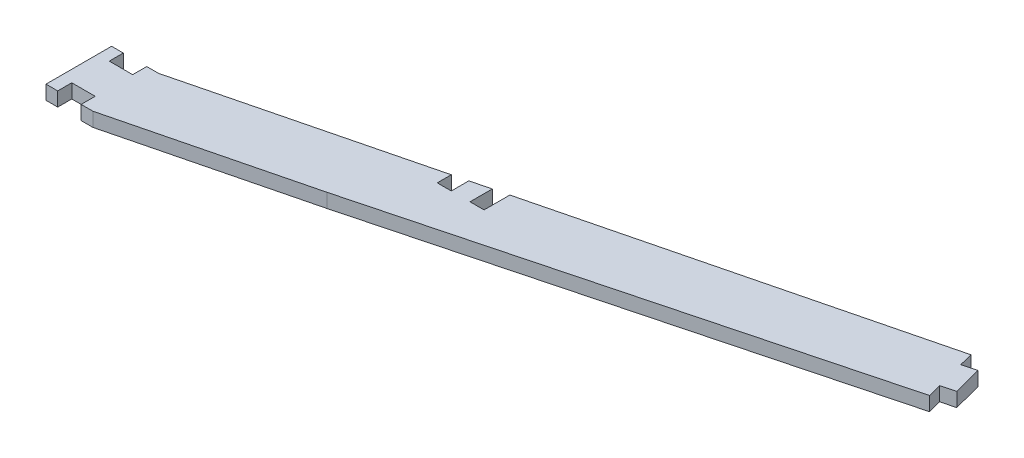
ISO-10303-21;
HEADER;
FILE_DESCRIPTION(('STEP AP214'),'2;1');
FILE_NAME('part.step','',(''),(''),'','','');
FILE_SCHEMA(('AUTOMOTIVE_DESIGN { 1 0 10303 214 1 1 1 1 }'));
ENDSEC;
DATA;
#1=APPLICATION_CONTEXT('core data for automotive mechanical design processes');
#2=APPLICATION_PROTOCOL_DEFINITION('international standard','automotive_design',2000,#1);
#3=PRODUCT_CONTEXT('',#1,'mechanical');
#4=PRODUCT('Part','Part','',(#3));
#5=PRODUCT_RELATED_PRODUCT_CATEGORY('part','',(#4));
#6=PRODUCT_DEFINITION_FORMATION('','',#4);
#7=PRODUCT_DEFINITION_CONTEXT('part definition',#1,'design');
#8=PRODUCT_DEFINITION('design','',#6,#7);
#9=PRODUCT_DEFINITION_SHAPE('','',#8);
#10=(LENGTH_UNIT() NAMED_UNIT(*) SI_UNIT(.MILLI.,.METRE.));
#11=(NAMED_UNIT(*) PLANE_ANGLE_UNIT() SI_UNIT($,.RADIAN.));
#12=(NAMED_UNIT(*) SI_UNIT($,.STERADIAN.) SOLID_ANGLE_UNIT());
#13=UNCERTAINTY_MEASURE_WITH_UNIT(LENGTH_MEASURE(1.E-05),#10,'distance_accuracy_value','');
#14=(GEOMETRIC_REPRESENTATION_CONTEXT(3) GLOBAL_UNCERTAINTY_ASSIGNED_CONTEXT((#13)) GLOBAL_UNIT_ASSIGNED_CONTEXT((#10,
#11,#12)) REPRESENTATION_CONTEXT('',''));
#15=CARTESIAN_POINT('',(0.,0.,0.));
#16=DIRECTION('',(0.,0.,1.));
#17=DIRECTION('',(1.,0.,0.));
#18=AXIS2_PLACEMENT_3D('',#15,#16,#17);
#19=CARTESIAN_POINT('',(0.,0.,0.));
#20=DIRECTION('',(0.,1.,0.));
#21=DIRECTION('',(0.,0.,1.));
#22=AXIS2_PLACEMENT_3D('',#19,#20,#21);
#23=PLANE('',#22);
#24=DIRECTION('',(-0.253898128412102,0.,-0.967230965379434));
#25=VECTOR('',#24,1.);
#26=CARTESIAN_POINT('',(260.774626782072,0.,-68.4533395302942));
#27=LINE('',#26,#25);
#28=CARTESIAN_POINT('',(309.276307822856,0.,116.3149691965));
#29=VERTEX_POINT('',#28);
#30=CARTESIAN_POINT('',(305.467835896674,0.,101.806504715809));
#31=VERTEX_POINT('',#30);
#32=EDGE_CURVE('E384',#29,#31,#27,.T.);
#33=ORIENTED_EDGE('',*,*,#32,.F.);
#34=DIRECTION('',(0.967230965379434,0.,-0.253898128412102));
#35=VECTOR('',#34,1.);
#36=CARTESIAN_POINT('',(600.,0.,39.9999999999999));
#37=LINE('',#36,#35);
#38=CARTESIAN_POINT('',(-200.,0.,250.));
#39=VERTEX_POINT('',#38);
#40=EDGE_CURVE('E411',#39,#29,#37,.T.);
#41=ORIENTED_EDGE('',*,*,#40,.F.);
#42=DIRECTION('',(0.970142500145332,0.,-0.242535625036333));
#43=VECTOR('',#42,1.);
#44=CARTESIAN_POINT('',(-400.,0.,300.));
#45=LINE('',#44,#43);
#46=CARTESIAN_POINT('',(-400.,0.,300.));
#47=VERTEX_POINT('',#46);
#48=EDGE_CURVE('E412',#47,#39,#45,.T.);
#49=ORIENTED_EDGE('',*,*,#48,.F.);
#50=DIRECTION('',(1.,0.,0.));
#51=VECTOR('',#50,1.);
#52=CARTESIAN_POINT('',(-450.,0.,300.));
#53=LINE('',#52,#51);
#54=CARTESIAN_POINT('',(-412.5,0.,300.));
#55=VERTEX_POINT('',#54);
#56=EDGE_CURVE('E386',#55,#47,#53,.T.);
#57=ORIENTED_EDGE('',*,*,#56,.F.);
#58=DIRECTION('',(0.,0.,-1.));
#59=VECTOR('',#58,1.);
#60=CARTESIAN_POINT('',(-412.5,0.,300.));
#61=LINE('',#60,#59);
#62=CARTESIAN_POINT('',(-412.5,0.,285.));
#63=VERTEX_POINT('',#62);
#64=EDGE_CURVE('E12',#55,#63,#61,.T.);
#65=ORIENTED_EDGE('',*,*,#64,.T.);
#66=DIRECTION('',(1.,0.,0.));
#67=VECTOR('',#66,1.);
#68=CARTESIAN_POINT('',(-450.,0.,285.));
#69=LINE('',#68,#67);
#70=CARTESIAN_POINT('',(-437.5,0.,285.));
#71=VERTEX_POINT('',#70);
#72=EDGE_CURVE('E402',#71,#63,#69,.T.);
#73=ORIENTED_EDGE('',*,*,#72,.F.);
#74=DIRECTION('',(0.,0.,1.));
#75=VECTOR('',#74,1.);
#76=CARTESIAN_POINT('',(-437.5,0.,300.));
#77=LINE('',#76,#75);
#78=CARTESIAN_POINT('',(-437.5,0.,300.));
#79=VERTEX_POINT('',#78);
#80=EDGE_CURVE('E390',#71,#79,#77,.T.);
#81=ORIENTED_EDGE('',*,*,#80,.T.);
#82=CARTESIAN_POINT('',(-450.,0.,300.));
#83=VERTEX_POINT('',#82);
#84=EDGE_CURVE('E387',#83,#79,#53,.T.);
#85=ORIENTED_EDGE('',*,*,#84,.F.);
#86=DIRECTION('',(0.,0.,1.));
#87=VECTOR('',#86,1.);
#88=CARTESIAN_POINT('',(-450.,0.,285.));
#89=LINE('',#88,#87);
#90=CARTESIAN_POINT('',(-450.,0.,230.));
#91=VERTEX_POINT('',#90);
#92=EDGE_CURVE('E420',#91,#83,#89,.T.);
#93=ORIENTED_EDGE('',*,*,#92,.F.);
#94=DIRECTION('',(1.,0.,0.));
#95=VECTOR('',#94,1.);
#96=CARTESIAN_POINT('',(-400.,0.,230.));
#97=LINE('',#96,#95);
#98=CARTESIAN_POINT('',(-437.5,0.,230.));
#99=VERTEX_POINT('',#98);
#100=EDGE_CURVE('E397',#91,#99,#97,.T.);
#101=ORIENTED_EDGE('',*,*,#100,.T.);
#102=DIRECTION('',(0.,0.,1.));
#103=VECTOR('',#102,1.);
#104=CARTESIAN_POINT('',(-437.5,0.,230.));
#105=LINE('',#104,#103);
#106=CARTESIAN_POINT('',(-437.5,0.,245.));
#107=VERTEX_POINT('',#106);
#108=EDGE_CURVE('E395',#99,#107,#105,.T.);
#109=ORIENTED_EDGE('',*,*,#108,.T.);
#110=DIRECTION('',(1.,0.,0.));
#111=VECTOR('',#110,1.);
#112=CARTESIAN_POINT('',(-450.,0.,245.));
#113=LINE('',#112,#111);
#114=CARTESIAN_POINT('',(-412.5,0.,245.));
#115=VERTEX_POINT('',#114);
#116=EDGE_CURVE('E472',#107,#115,#113,.T.);
#117=ORIENTED_EDGE('',*,*,#116,.T.);
#118=DIRECTION('',(0.,0.,-1.));
#119=VECTOR('',#118,1.);
#120=CARTESIAN_POINT('',(-412.5,0.,230.));
#121=LINE('',#120,#119);
#122=CARTESIAN_POINT('',(-412.5,0.,230.));
#123=VERTEX_POINT('',#122);
#124=EDGE_CURVE('E392',#115,#123,#121,.T.);
#125=ORIENTED_EDGE('',*,*,#124,.T.);
#126=DIRECTION('',(1.,0.,0.));
#127=VECTOR('',#126,1.);
#128=CARTESIAN_POINT('',(-400.,0.,230.));
#129=LINE('',#128,#127);
#130=CARTESIAN_POINT('',(-400.,0.,230.));
#131=VERTEX_POINT('',#130);
#132=EDGE_CURVE('E394',#123,#131,#129,.T.);
#133=ORIENTED_EDGE('',*,*,#132,.T.);
#134=DIRECTION('',(0.970142500145332,0.,-0.242535625036333));
#135=VECTOR('',#134,1.);
#136=CARTESIAN_POINT('',(-400.,0.,230.));
#137=LINE('',#136,#135);
#138=CARTESIAN_POINT('',(-150.,0.,167.5));
#139=VERTEX_POINT('',#138);
#140=EDGE_CURVE('E99',#131,#139,#137,.T.);
#141=ORIENTED_EDGE('',*,*,#140,.T.);
#142=DIRECTION('',(0.,0.,1.));
#143=VECTOR('',#142,1.);
#144=CARTESIAN_POINT('',(-150.,0.,0.));
#145=LINE('',#144,#143);
#146=CARTESIAN_POINT('',(-150.,0.,182.5));
#147=VERTEX_POINT('',#146);
#148=EDGE_CURVE('E292',#139,#147,#145,.T.);
#149=ORIENTED_EDGE('',*,*,#148,.T.);
#150=DIRECTION('',(1.,0.,0.));
#151=VECTOR('',#150,1.);
#152=CARTESIAN_POINT('',(3.37692836656818E-13,0.,182.5));
#153=LINE('',#152,#151);
#154=CARTESIAN_POINT('',(-135.,0.,182.5));
#155=VERTEX_POINT('',#154);
#156=EDGE_CURVE('E361',#147,#155,#153,.T.);
#157=ORIENTED_EDGE('',*,*,#156,.T.);
#158=DIRECTION('',(0.,0.,-1.));
#159=VECTOR('',#158,1.);
#160=CARTESIAN_POINT('',(-135.,0.,3.99680288865059E-13));
#161=LINE('',#160,#159);
#162=CARTESIAN_POINT('',(-135.,0.,163.75));
#163=VERTEX_POINT('',#162);
#164=EDGE_CURVE('E364',#155,#163,#161,.T.);
#165=ORIENTED_EDGE('',*,*,#164,.T.);
#166=DIRECTION('',(0.970142500145332,0.,-0.242535625036333));
#167=VECTOR('',#166,1.);
#168=CARTESIAN_POINT('',(30.5882352941177,0.,122.352941176471));
#169=LINE('',#168,#167);
#170=CARTESIAN_POINT('',(-115.,0.,158.75));
#171=VERTEX_POINT('',#170);
#172=EDGE_CURVE('E367',#163,#171,#169,.T.);
#173=ORIENTED_EDGE('',*,*,#172,.T.);
#174=DIRECTION('',(0.,0.,-1.));
#175=VECTOR('',#174,1.);
#176=CARTESIAN_POINT('',(-115.,0.,-1.34395418770413E-13));
#177=LINE('',#176,#175);
#178=CARTESIAN_POINT('',(-115.,0.,182.5));
#179=VERTEX_POINT('',#178);
#180=EDGE_CURVE('E370',#179,#171,#177,.T.);
#181=ORIENTED_EDGE('',*,*,#180,.F.);
#182=DIRECTION('',(-1.,0.,0.));
#183=VECTOR('',#182,1.);
#184=CARTESIAN_POINT('',(0.,0.,182.5));
#185=LINE('',#184,#183);
#186=CARTESIAN_POINT('',(-99.9999999999999,0.,182.5));
#187=VERTEX_POINT('',#186);
#188=EDGE_CURVE('E372',#187,#179,#185,.T.);
#189=ORIENTED_EDGE('',*,*,#188,.F.);
#190=DIRECTION('',(0.,0.,1.));
#191=VECTOR('',#190,1.);
#192=CARTESIAN_POINT('',(-99.9999999999999,0.,0.));
#193=LINE('',#192,#191);
#194=CARTESIAN_POINT('',(-99.9999999999999,0.,155.));
#195=VERTEX_POINT('',#194);
#196=EDGE_CURVE('E374',#195,#187,#193,.T.);
#197=ORIENTED_EDGE('',*,*,#196,.F.);
#198=DIRECTION('',(0.970142500145332,0.,-0.242535625036333));
#199=VECTOR('',#198,1.);
#200=CARTESIAN_POINT('',(30.5882352941176,0.,122.352941176471));
#201=LINE('',#200,#199);
#202=CARTESIAN_POINT('',(293.601058917325,0.,56.5997352706688));
#203=VERTEX_POINT('',#202);
#204=EDGE_CURVE('E433',#195,#203,#201,.T.);
#205=ORIENTED_EDGE('',*,*,#204,.T.);
#206=DIRECTION('',(0.253898128412106,0.,0.967230965379433));
#207=VECTOR('',#206,1.);
#208=CARTESIAN_POINT('',(260.774626782071,0.,-68.4533395302951));
#209=LINE('',#208,#207);
#210=CARTESIAN_POINT('',(297.409530843507,0.,71.1081997513603));
#211=VERTEX_POINT('',#210);
#212=EDGE_CURVE('E113',#203,#211,#209,.T.);
#213=ORIENTED_EDGE('',*,*,#212,.T.);
#214=DIRECTION('',(0.967230965379434,0.,-0.253898128412102));
#215=VECTOR('',#214,1.);
#216=CARTESIAN_POINT('',(36.6349040614344,0.,139.561539281655));
#217=LINE('',#216,#215);
#218=CARTESIAN_POINT('',(311.917995324198,0.,67.2997278251788));
#219=VERTEX_POINT('',#218);
#220=EDGE_CURVE('E376',#211,#219,#217,.T.);
#221=ORIENTED_EDGE('',*,*,#220,.T.);
#222=DIRECTION('',(0.253898128412102,0.,0.967230965379434));
#223=VECTOR('',#222,1.);
#224=CARTESIAN_POINT('',(275.283091262764,0.,-72.2618114564757));
#225=LINE('',#224,#223);
#226=CARTESIAN_POINT('',(319.976300377366,0.,97.9980327896271));
#227=VERTEX_POINT('',#226);
#228=EDGE_CURVE('E379',#219,#227,#225,.T.);
#229=ORIENTED_EDGE('',*,*,#228,.T.);
#230=DIRECTION('',(0.967230965379434,0.,-0.253898128412101));
#231=VECTOR('',#230,1.);
#232=CARTESIAN_POINT('',(44.6932091146019,0.,170.259844246103));
#233=LINE('',#232,#231);
#234=EDGE_CURVE('E382',#31,#227,#233,.T.);
#235=ORIENTED_EDGE('',*,*,#234,.F.);
#236=EDGE_LOOP('',(#33,#41,#49,#57,#65,#73,#81,#85,#93,#101,#109,#117,#125,#133,#141,#149,#157,
#165,#173,#181,#189,#197,#205,#213,#221,#229,#235));
#237=FACE_BOUND('',#236,.T.);
#238=ADVANCED_FACE('F95',(#237),#23,.F.);
#239=CARTESIAN_POINT('',(600.,15.,39.9999999999999));
#240=DIRECTION('',(-0.253898128412102,0.,-0.967230965379434));
#241=DIRECTION('',(-0.967230965379434,0.,0.253898128412102));
#242=AXIS2_PLACEMENT_3D('',#239,#240,#241);
#243=PLANE('',#242);
#244=DIRECTION('',(0.,1.,0.));
#245=VECTOR('',#244,1.);
#246=CARTESIAN_POINT('',(309.276307822856,-1.2E-05,116.3149691965));
#247=LINE('',#246,#245);
#248=CARTESIAN_POINT('',(309.276307822856,15.,116.3149691965));
#249=VERTEX_POINT('',#248);
#250=EDGE_CURVE('E332',#29,#249,#247,.T.);
#251=ORIENTED_EDGE('',*,*,#250,.T.);
#252=DIRECTION('',(0.967230965379434,0.,-0.253898128412102));
#253=VECTOR('',#252,1.);
#254=CARTESIAN_POINT('',(600.,15.,39.9999999999999));
#255=LINE('',#254,#253);
#256=CARTESIAN_POINT('',(-200.,15.,250.));
#257=VERTEX_POINT('',#256);
#258=EDGE_CURVE('E421',#257,#249,#255,.T.);
#259=ORIENTED_EDGE('',*,*,#258,.F.);
#260=DIRECTION('',(0.,-1.,0.));
#261=VECTOR('',#260,1.);
#262=CARTESIAN_POINT('',(-200.,15.,250.));
#263=LINE('',#262,#261);
#264=EDGE_CURVE('E413',#257,#39,#263,.T.);
#265=ORIENTED_EDGE('',*,*,#264,.T.);
#266=ORIENTED_EDGE('',*,*,#40,.T.);
#267=EDGE_LOOP('',(#251,#259,#265,#266));
#268=FACE_BOUND('',#267,.T.);
#269=ADVANCED_FACE('F521',(#268),#243,.F.);
#270=CARTESIAN_POINT('',(0.,15.,0.));
#271=DIRECTION('',(0.,1.,0.));
#272=DIRECTION('',(0.,0.,1.));
#273=AXIS2_PLACEMENT_3D('',#270,#271,#272);
#274=PLANE('',#273);
#275=ORIENTED_EDGE('',*,*,#258,.T.);
#276=DIRECTION('',(-0.253898128412102,0.,-0.967230965379434));
#277=VECTOR('',#276,1.);
#278=CARTESIAN_POINT('',(260.774626782072,15.,-68.4533395302942));
#279=LINE('',#278,#277);
#280=CARTESIAN_POINT('',(305.467835896674,15.,101.806504715809));
#281=VERTEX_POINT('',#280);
#282=EDGE_CURVE('E294',#249,#281,#279,.T.);
#283=ORIENTED_EDGE('',*,*,#282,.T.);
#284=DIRECTION('',(0.967230965379434,0.,-0.253898128412101));
#285=VECTOR('',#284,1.);
#286=CARTESIAN_POINT('',(44.6932091146019,15.,170.259844246103));
#287=LINE('',#286,#285);
#288=CARTESIAN_POINT('',(319.976300377366,15.,97.9980327896271));
#289=VERTEX_POINT('',#288);
#290=EDGE_CURVE('E327',#281,#289,#287,.T.);
#291=ORIENTED_EDGE('',*,*,#290,.T.);
#292=DIRECTION('',(0.253898128412102,0.,0.967230965379434));
#293=VECTOR('',#292,1.);
#294=CARTESIAN_POINT('',(275.283091262764,15.,-72.2618114564757));
#295=LINE('',#294,#293);
#296=CARTESIAN_POINT('',(311.917995324198,15.,67.2997278251788));
#297=VERTEX_POINT('',#296);
#298=EDGE_CURVE('E324',#297,#289,#295,.T.);
#299=ORIENTED_EDGE('',*,*,#298,.F.);
#300=DIRECTION('',(0.967230965379434,0.,-0.253898128412102));
#301=VECTOR('',#300,1.);
#302=CARTESIAN_POINT('',(36.6349040614344,15.,139.561539281655));
#303=LINE('',#302,#301);
#304=CARTESIAN_POINT('',(297.409530843507,15.,71.1081997513603));
#305=VERTEX_POINT('',#304);
#306=EDGE_CURVE('E321',#305,#297,#303,.T.);
#307=ORIENTED_EDGE('',*,*,#306,.F.);
#308=DIRECTION('',(0.253898128412106,0.,0.967230965379433));
#309=VECTOR('',#308,1.);
#310=CARTESIAN_POINT('',(260.774626782071,15.,-68.4533395302951));
#311=LINE('',#310,#309);
#312=CARTESIAN_POINT('',(293.601058917325,15.,56.5997352706687));
#313=VERTEX_POINT('',#312);
#314=EDGE_CURVE('E318',#313,#305,#311,.T.);
#315=ORIENTED_EDGE('',*,*,#314,.F.);
#316=DIRECTION('',(0.970142500145332,0.,-0.242535625036333));
#317=VECTOR('',#316,1.);
#318=CARTESIAN_POINT('',(-99.9999999999999,15.,155.));
#319=LINE('',#318,#317);
#320=CARTESIAN_POINT('',(-99.9999999999999,15.,155.));
#321=VERTEX_POINT('',#320);
#322=EDGE_CURVE('E431',#321,#313,#319,.T.);
#323=ORIENTED_EDGE('',*,*,#322,.F.);
#324=DIRECTION('',(0.,0.,1.));
#325=VECTOR('',#324,1.);
#326=CARTESIAN_POINT('',(-99.9999999999999,15.,0.));
#327=LINE('',#326,#325);
#328=CARTESIAN_POINT('',(-99.9999999999999,15.,182.5));
#329=VERTEX_POINT('',#328);
#330=EDGE_CURVE('E315',#321,#329,#327,.T.);
#331=ORIENTED_EDGE('',*,*,#330,.T.);
#332=DIRECTION('',(-1.,0.,0.));
#333=VECTOR('',#332,1.);
#334=CARTESIAN_POINT('',(0.,15.,182.5));
#335=LINE('',#334,#333);
#336=CARTESIAN_POINT('',(-115.,15.,182.5));
#337=VERTEX_POINT('',#336);
#338=EDGE_CURVE('E312',#329,#337,#335,.T.);
#339=ORIENTED_EDGE('',*,*,#338,.T.);
#340=DIRECTION('',(0.,0.,-1.));
#341=VECTOR('',#340,1.);
#342=CARTESIAN_POINT('',(-115.,15.,-1.34395418770413E-13));
#343=LINE('',#342,#341);
#344=CARTESIAN_POINT('',(-115.,15.,158.75));
#345=VERTEX_POINT('',#344);
#346=EDGE_CURVE('E309',#337,#345,#343,.T.);
#347=ORIENTED_EDGE('',*,*,#346,.T.);
#348=DIRECTION('',(0.970142500145332,0.,-0.242535625036333));
#349=VECTOR('',#348,1.);
#350=CARTESIAN_POINT('',(30.5882352941177,15.,122.352941176471));
#351=LINE('',#350,#349);
#352=CARTESIAN_POINT('',(-135.,15.,163.75));
#353=VERTEX_POINT('',#352);
#354=EDGE_CURVE('E305',#353,#345,#351,.T.);
#355=ORIENTED_EDGE('',*,*,#354,.F.);
#356=DIRECTION('',(0.,0.,-1.));
#357=VECTOR('',#356,1.);
#358=CARTESIAN_POINT('',(-135.,15.,3.99680288865059E-13));
#359=LINE('',#358,#357);
#360=CARTESIAN_POINT('',(-135.,15.,182.5));
#361=VERTEX_POINT('',#360);
#362=EDGE_CURVE('E302',#361,#353,#359,.T.);
#363=ORIENTED_EDGE('',*,*,#362,.F.);
#364=DIRECTION('',(1.,0.,0.));
#365=VECTOR('',#364,1.);
#366=CARTESIAN_POINT('',(3.37692836656818E-13,15.,182.5));
#367=LINE('',#366,#365);
#368=CARTESIAN_POINT('',(-150.,15.,182.5));
#369=VERTEX_POINT('',#368);
#370=EDGE_CURVE('E300',#369,#361,#367,.T.);
#371=ORIENTED_EDGE('',*,*,#370,.F.);
#372=DIRECTION('',(0.,0.,1.));
#373=VECTOR('',#372,1.);
#374=CARTESIAN_POINT('',(-150.,15.,0.));
#375=LINE('',#374,#373);
#376=CARTESIAN_POINT('',(-150.,15.,167.5));
#377=VERTEX_POINT('',#376);
#378=EDGE_CURVE('E289',#377,#369,#375,.T.);
#379=ORIENTED_EDGE('',*,*,#378,.F.);
#380=DIRECTION('',(0.970142500145332,0.,-0.242535625036333));
#381=VECTOR('',#380,1.);
#382=CARTESIAN_POINT('',(-150.,15.,167.5));
#383=LINE('',#382,#381);
#384=CARTESIAN_POINT('',(-400.,15.,230.));
#385=VERTEX_POINT('',#384);
#386=EDGE_CURVE('E272',#385,#377,#383,.T.);
#387=ORIENTED_EDGE('',*,*,#386,.F.);
#388=DIRECTION('',(1.,0.,0.));
#389=VECTOR('',#388,1.);
#390=CARTESIAN_POINT('',(-400.,15.,230.));
#391=LINE('',#390,#389);
#392=CARTESIAN_POINT('',(-412.5,15.,230.));
#393=VERTEX_POINT('',#392);
#394=EDGE_CURVE('E455',#393,#385,#391,.T.);
#395=ORIENTED_EDGE('',*,*,#394,.F.);
#396=DIRECTION('',(0.,0.,-1.));
#397=VECTOR('',#396,1.);
#398=CARTESIAN_POINT('',(-412.500000000001,15.,1.52655665885959E-12));
#399=LINE('',#398,#397);
#400=CARTESIAN_POINT('',(-412.5,15.,245.));
#401=VERTEX_POINT('',#400);
#402=EDGE_CURVE('E452',#401,#393,#399,.T.);
#403=ORIENTED_EDGE('',*,*,#402,.F.);
#404=DIRECTION('',(1.,0.,0.));
#405=VECTOR('',#404,1.);
#406=CARTESIAN_POINT('',(0.,15.,245.));
#407=LINE('',#406,#405);
#408=CARTESIAN_POINT('',(-437.5,15.,245.));
#409=VERTEX_POINT('',#408);
#410=EDGE_CURVE('E461',#409,#401,#407,.T.);
#411=ORIENTED_EDGE('',*,*,#410,.F.);
#412=DIRECTION('',(0.,0.,1.));
#413=VECTOR('',#412,1.);
#414=CARTESIAN_POINT('',(-437.499999999999,15.,-1.61907524424502E-12));
#415=LINE('',#414,#413);
#416=CARTESIAN_POINT('',(-437.5,15.,230.));
#417=VERTEX_POINT('',#416);
#418=EDGE_CURVE('E453',#417,#409,#415,.T.);
#419=ORIENTED_EDGE('',*,*,#418,.F.);
#420=CARTESIAN_POINT('',(-450.,15.,230.));
#421=VERTEX_POINT('',#420);
#422=EDGE_CURVE('E407',#421,#417,#391,.T.);
#423=ORIENTED_EDGE('',*,*,#422,.F.);
#424=DIRECTION('',(0.,0.,1.));
#425=VECTOR('',#424,1.);
#426=CARTESIAN_POINT('',(-450.,15.,-300.));
#427=LINE('',#426,#425);
#428=CARTESIAN_POINT('',(-450.,15.,300.));
#429=VERTEX_POINT('',#428);
#430=EDGE_CURVE('E423',#421,#429,#427,.T.);
#431=ORIENTED_EDGE('',*,*,#430,.T.);
#432=DIRECTION('',(1.,0.,0.));
#433=VECTOR('',#432,1.);
#434=CARTESIAN_POINT('',(-450.,15.,300.));
#435=LINE('',#434,#433);
#436=CARTESIAN_POINT('',(-437.5,15.,300.));
#437=VERTEX_POINT('',#436);
#438=EDGE_CURVE('E282',#429,#437,#435,.T.);
#439=ORIENTED_EDGE('',*,*,#438,.T.);
#440=DIRECTION('',(0.,0.,1.));
#441=VECTOR('',#440,1.);
#442=CARTESIAN_POINT('',(-437.5,15.,0.));
#443=LINE('',#442,#441);
#444=CARTESIAN_POINT('',(-437.5,15.,285.));
#445=VERTEX_POINT('',#444);
#446=EDGE_CURVE('E443',#445,#437,#443,.T.);
#447=ORIENTED_EDGE('',*,*,#446,.F.);
#448=DIRECTION('',(-1.,0.,0.));
#449=VECTOR('',#448,1.);
#450=CARTESIAN_POINT('',(0.,15.,285.));
#451=LINE('',#450,#449);
#452=CARTESIAN_POINT('',(-412.5,15.,285.));
#453=VERTEX_POINT('',#452);
#454=EDGE_CURVE('E400',#453,#445,#451,.T.);
#455=ORIENTED_EDGE('',*,*,#454,.F.);
#456=DIRECTION('',(0.,0.,-1.));
#457=VECTOR('',#456,1.);
#458=CARTESIAN_POINT('',(-412.5,15.,0.));
#459=LINE('',#458,#457);
#460=CARTESIAN_POINT('',(-412.5,15.,300.));
#461=VERTEX_POINT('',#460);
#462=EDGE_CURVE('E105',#461,#453,#459,.T.);
#463=ORIENTED_EDGE('',*,*,#462,.F.);
#464=CARTESIAN_POINT('',(-400.,15.,300.));
#465=VERTEX_POINT('',#464);
#466=EDGE_CURVE('E416',#461,#465,#435,.T.);
#467=ORIENTED_EDGE('',*,*,#466,.T.);
#468=DIRECTION('',(0.970142500145332,0.,-0.242535625036333));
#469=VECTOR('',#468,1.);
#470=CARTESIAN_POINT('',(-400.,15.,300.));
#471=LINE('',#470,#469);
#472=EDGE_CURVE('E424',#465,#257,#471,.T.);
#473=ORIENTED_EDGE('',*,*,#472,.T.);
#474=EDGE_LOOP('',(#275,#283,#291,#299,#307,#315,#323,#331,#339,#347,#355,#363,#371,#379,#387,
#395,#403,#411,#419,#423,#431,#439,#447,#455,#463,#467,#473));
#475=FACE_BOUND('',#474,.T.);
#476=ADVANCED_FACE('F297',(#475),#274,.T.);
#477=CARTESIAN_POINT('',(-450.,15.,300.));
#478=DIRECTION('',(0.,0.,-1.));
#479=DIRECTION('',(-1.,0.,0.));
#480=AXIS2_PLACEMENT_3D('',#477,#478,#479);
#481=PLANE('',#480);
#482=ORIENTED_EDGE('',*,*,#84,.T.);
#483=DIRECTION('',(0.,1.,0.));
#484=VECTOR('',#483,1.);
#485=CARTESIAN_POINT('',(-437.5,-40.,300.));
#486=LINE('',#485,#484);
#487=EDGE_CURVE('E399',#79,#437,#486,.T.);
#488=ORIENTED_EDGE('',*,*,#487,.T.);
#489=ORIENTED_EDGE('',*,*,#438,.F.);
#490=DIRECTION('',(0.,-1.,0.));
#491=VECTOR('',#490,1.);
#492=CARTESIAN_POINT('',(-450.,15.,300.));
#493=LINE('',#492,#491);
#494=EDGE_CURVE('E404',#429,#83,#493,.T.);
#495=ORIENTED_EDGE('',*,*,#494,.T.);
#496=EDGE_LOOP('',(#482,#488,#489,#495));
#497=FACE_BOUND('',#496,.T.);
#498=ADVANCED_FACE('F492',(#497),#481,.F.);
#499=CARTESIAN_POINT('',(-400.,-40.,230.));
#500=DIRECTION('',(0.,0.,1.));
#501=DIRECTION('',(1.,0.,0.));
#502=AXIS2_PLACEMENT_3D('',#499,#500,#501);
#503=PLANE('',#502);
#504=ORIENTED_EDGE('',*,*,#100,.F.);
#505=DIRECTION('',(0.,1.,0.));
#506=VECTOR('',#505,1.);
#507=CARTESIAN_POINT('',(-450.,-40.,230.));
#508=LINE('',#507,#506);
#509=EDGE_CURVE('E475',#91,#421,#508,.T.);
#510=ORIENTED_EDGE('',*,*,#509,.T.);
#511=ORIENTED_EDGE('',*,*,#422,.T.);
#512=DIRECTION('',(0.,1.,0.));
#513=VECTOR('',#512,1.);
#514=CARTESIAN_POINT('',(-437.5,-40.,230.));
#515=LINE('',#514,#513);
#516=EDGE_CURVE('E450',#99,#417,#515,.T.);
#517=ORIENTED_EDGE('',*,*,#516,.F.);
#518=EDGE_LOOP('',(#504,#510,#511,#517));
#519=FACE_BOUND('',#518,.T.);
#520=ADVANCED_FACE('F481',(#519),#503,.F.);
#521=CARTESIAN_POINT('',(-450.,15.,-300.));
#522=DIRECTION('',(1.,0.,0.));
#523=DIRECTION('',(0.,0.,-1.));
#524=AXIS2_PLACEMENT_3D('',#521,#522,#523);
#525=PLANE('',#524);
#526=ORIENTED_EDGE('',*,*,#92,.T.);
#527=ORIENTED_EDGE('',*,*,#494,.F.);
#528=ORIENTED_EDGE('',*,*,#430,.F.);
#529=ORIENTED_EDGE('',*,*,#509,.F.);
#530=EDGE_LOOP('',(#526,#527,#528,#529));
#531=FACE_BOUND('',#530,.T.);
#532=ADVANCED_FACE('F489',(#531),#525,.F.);
#533=ORIENTED_EDGE('',*,*,#56,.T.);
#534=DIRECTION('',(0.,-1.,0.));
#535=VECTOR('',#534,1.);
#536=CARTESIAN_POINT('',(-400.,15.,300.));
#537=LINE('',#536,#535);
#538=EDGE_CURVE('E408',#465,#47,#537,.T.);
#539=ORIENTED_EDGE('',*,*,#538,.F.);
#540=ORIENTED_EDGE('',*,*,#466,.F.);
#541=DIRECTION('',(0.,1.,0.));
#542=VECTOR('',#541,1.);
#543=CARTESIAN_POINT('',(-412.5,-40.,300.));
#544=LINE('',#543,#542);
#545=EDGE_CURVE('E447',#55,#461,#544,.T.);
#546=ORIENTED_EDGE('',*,*,#545,.F.);
#547=EDGE_LOOP('',(#533,#539,#540,#546));
#548=FACE_BOUND('',#547,.T.);
#549=ADVANCED_FACE('F512',(#548),#481,.F.);
#550=ORIENTED_EDGE('',*,*,#132,.F.);
#551=DIRECTION('',(0.,1.,0.));
#552=VECTOR('',#551,1.);
#553=CARTESIAN_POINT('',(-412.5,-40.,230.));
#554=LINE('',#553,#552);
#555=EDGE_CURVE('E437',#123,#393,#554,.T.);
#556=ORIENTED_EDGE('',*,*,#555,.T.);
#557=ORIENTED_EDGE('',*,*,#394,.T.);
#558=DIRECTION('',(0.,1.,0.));
#559=VECTOR('',#558,1.);
#560=CARTESIAN_POINT('',(-400.,-40.,230.));
#561=LINE('',#560,#559);
#562=EDGE_CURVE('E278',#131,#385,#561,.T.);
#563=ORIENTED_EDGE('',*,*,#562,.F.);
#564=EDGE_LOOP('',(#550,#556,#557,#563));
#565=FACE_BOUND('',#564,.T.);
#566=ADVANCED_FACE('F557',(#565),#503,.F.);
#567=CARTESIAN_POINT('',(-437.5,-40.,230.));
#568=DIRECTION('',(-1.,0.,0.));
#569=DIRECTION('',(0.,0.,1.));
#570=AXIS2_PLACEMENT_3D('',#567,#568,#569);
#571=PLANE('',#570);
#572=ORIENTED_EDGE('',*,*,#108,.F.);
#573=ORIENTED_EDGE('',*,*,#516,.T.);
#574=ORIENTED_EDGE('',*,*,#418,.T.);
#575=DIRECTION('',(0.,1.,0.));
#576=VECTOR('',#575,1.);
#577=CARTESIAN_POINT('',(-437.5,-40.,245.));
#578=LINE('',#577,#576);
#579=EDGE_CURVE('E458',#107,#409,#578,.T.);
#580=ORIENTED_EDGE('',*,*,#579,.F.);
#581=EDGE_LOOP('',(#572,#573,#574,#580));
#582=FACE_BOUND('',#581,.T.);
#583=ADVANCED_FACE('F569',(#582),#571,.F.);
#584=CARTESIAN_POINT('',(-412.5,-40.,230.));
#585=DIRECTION('',(1.,0.,0.));
#586=DIRECTION('',(0.,0.,-1.));
#587=AXIS2_PLACEMENT_3D('',#584,#585,#586);
#588=PLANE('',#587);
#589=ORIENTED_EDGE('',*,*,#124,.F.);
#590=DIRECTION('',(0.,1.,0.));
#591=VECTOR('',#590,1.);
#592=CARTESIAN_POINT('',(-412.5,-40.,245.));
#593=LINE('',#592,#591);
#594=EDGE_CURVE('E446',#115,#401,#593,.T.);
#595=ORIENTED_EDGE('',*,*,#594,.T.);
#596=ORIENTED_EDGE('',*,*,#402,.T.);
#597=ORIENTED_EDGE('',*,*,#555,.F.);
#598=EDGE_LOOP('',(#589,#595,#596,#597));
#599=FACE_BOUND('',#598,.T.);
#600=ADVANCED_FACE('F561',(#599),#588,.F.);
#601=CARTESIAN_POINT('',(-437.5,-40.,300.));
#602=DIRECTION('',(-1.,0.,0.));
#603=DIRECTION('',(0.,0.,1.));
#604=AXIS2_PLACEMENT_3D('',#601,#602,#603);
#605=PLANE('',#604);
#606=ORIENTED_EDGE('',*,*,#80,.F.);
#607=DIRECTION('',(0.,1.,0.));
#608=VECTOR('',#607,1.);
#609=CARTESIAN_POINT('',(-437.5,-40.,285.));
#610=LINE('',#609,#608);
#611=EDGE_CURVE('E440',#71,#445,#610,.T.);
#612=ORIENTED_EDGE('',*,*,#611,.T.);
#613=ORIENTED_EDGE('',*,*,#446,.T.);
#614=ORIENTED_EDGE('',*,*,#487,.F.);
#615=EDGE_LOOP('',(#606,#612,#613,#614));
#616=FACE_BOUND('',#615,.T.);
#617=ADVANCED_FACE('F498',(#616),#605,.F.);
#618=CARTESIAN_POINT('',(-412.5,-40.,300.));
#619=DIRECTION('',(1.,0.,0.));
#620=DIRECTION('',(0.,0.,-1.));
#621=AXIS2_PLACEMENT_3D('',#618,#619,#620);
#622=PLANE('',#621);
#623=ORIENTED_EDGE('',*,*,#64,.F.);
#624=ORIENTED_EDGE('',*,*,#545,.T.);
#625=ORIENTED_EDGE('',*,*,#462,.T.);
#626=DIRECTION('',(0.,1.,0.));
#627=VECTOR('',#626,1.);
#628=CARTESIAN_POINT('',(-412.5,-40.,285.));
#629=LINE('',#628,#627);
#630=EDGE_CURVE('E403',#63,#453,#629,.T.);
#631=ORIENTED_EDGE('',*,*,#630,.F.);
#632=EDGE_LOOP('',(#623,#624,#625,#631));
#633=FACE_BOUND('',#632,.T.);
#634=ADVANCED_FACE('F509',(#633),#622,.F.);
#635=CARTESIAN_POINT('',(-400.,15.,300.));
#636=DIRECTION('',(-0.242535625036333,0.,-0.970142500145332));
#637=DIRECTION('',(-0.970142500145332,0.,0.242535625036333));
#638=AXIS2_PLACEMENT_3D('',#635,#636,#637);
#639=PLANE('',#638);
#640=ORIENTED_EDGE('',*,*,#48,.T.);
#641=ORIENTED_EDGE('',*,*,#264,.F.);
#642=ORIENTED_EDGE('',*,*,#472,.F.);
#643=ORIENTED_EDGE('',*,*,#538,.T.);
#644=EDGE_LOOP('',(#640,#641,#642,#643));
#645=FACE_BOUND('',#644,.T.);
#646=ADVANCED_FACE('F518',(#645),#639,.F.);
#647=CARTESIAN_POINT('',(-150.,-40.,167.5));
#648=DIRECTION('',(0.242535625036333,0.,0.970142500145332));
#649=DIRECTION('',(0.970142500145332,0.,-0.242535625036333));
#650=AXIS2_PLACEMENT_3D('',#647,#648,#649);
#651=PLANE('',#650);
#652=ORIENTED_EDGE('',*,*,#386,.T.);
#653=DIRECTION('',(0.,1.,0.));
#654=VECTOR('',#653,1.);
#655=CARTESIAN_POINT('',(-150.,-1.2E-05,167.5));
#656=LINE('',#655,#654);
#657=EDGE_CURVE('E276',#139,#377,#656,.T.);
#658=ORIENTED_EDGE('',*,*,#657,.F.);
#659=ORIENTED_EDGE('',*,*,#140,.F.);
#660=ORIENTED_EDGE('',*,*,#562,.T.);
#661=EDGE_LOOP('',(#652,#658,#659,#660));
#662=FACE_BOUND('',#661,.T.);
#663=ADVANCED_FACE('F274',(#662),#651,.F.);
#664=CARTESIAN_POINT('',(-99.9999999999999,-40.,155.));
#665=DIRECTION('',(0.242535625036333,0.,0.970142500145332));
#666=DIRECTION('',(0.970142500145332,0.,-0.242535625036333));
#667=AXIS2_PLACEMENT_3D('',#664,#665,#666);
#668=PLANE('',#667);
#669=ORIENTED_EDGE('',*,*,#322,.T.);
#670=DIRECTION('',(0.,1.,0.));
#671=VECTOR('',#670,1.);
#672=CARTESIAN_POINT('',(293.601058917325,-1.2E-05,56.5997352706687));
#673=LINE('',#672,#671);
#674=EDGE_CURVE('E343',#203,#313,#673,.T.);
#675=ORIENTED_EDGE('',*,*,#674,.F.);
#676=ORIENTED_EDGE('',*,*,#204,.F.);
#677=DIRECTION('',(0.,1.,0.));
#678=VECTOR('',#677,1.);
#679=CARTESIAN_POINT('',(-99.9999999999999,-1.2E-05,155.));
#680=LINE('',#679,#678);
#681=EDGE_CURVE('E345',#195,#321,#680,.T.);
#682=ORIENTED_EDGE('',*,*,#681,.T.);
#683=EDGE_LOOP('',(#669,#675,#676,#682));
#684=FACE_BOUND('',#683,.T.);
#685=ADVANCED_FACE('F541',(#684),#668,.F.);
#686=CARTESIAN_POINT('',(-437.5,-40.,245.));
#687=DIRECTION('',(0.,0.,1.));
#688=DIRECTION('',(1.,0.,0.));
#689=AXIS2_PLACEMENT_3D('',#686,#687,#688);
#690=PLANE('',#689);
#691=ORIENTED_EDGE('',*,*,#579,.T.);
#692=ORIENTED_EDGE('',*,*,#410,.T.);
#693=ORIENTED_EDGE('',*,*,#594,.F.);
#694=ORIENTED_EDGE('',*,*,#116,.F.);
#695=EDGE_LOOP('',(#691,#692,#693,#694));
#696=FACE_BOUND('',#695,.T.);
#697=ADVANCED_FACE('F565',(#696),#690,.F.);
#698=CARTESIAN_POINT('',(-437.5,-40.,285.));
#699=DIRECTION('',(0.,0.,-1.));
#700=DIRECTION('',(-1.,0.,0.));
#701=AXIS2_PLACEMENT_3D('',#698,#699,#700);
#702=PLANE('',#701);
#703=ORIENTED_EDGE('',*,*,#630,.T.);
#704=ORIENTED_EDGE('',*,*,#454,.T.);
#705=ORIENTED_EDGE('',*,*,#611,.F.);
#706=ORIENTED_EDGE('',*,*,#72,.T.);
#707=EDGE_LOOP('',(#703,#704,#705,#706));
#708=FACE_BOUND('',#707,.T.);
#709=ADVANCED_FACE('F97',(#708),#702,.F.);
#710=CARTESIAN_POINT('',(-150.,-1.2E-05,0.));
#711=DIRECTION('',(-1.,0.,0.));
#712=DIRECTION('',(0.,0.,1.));
#713=AXIS2_PLACEMENT_3D('',#710,#711,#712);
#714=PLANE('',#713);
#715=ORIENTED_EDGE('',*,*,#657,.T.);
#716=ORIENTED_EDGE('',*,*,#378,.T.);
#717=DIRECTION('',(0.,1.,0.));
#718=VECTOR('',#717,1.);
#719=CARTESIAN_POINT('',(-150.,-1.2E-05,182.5));
#720=LINE('',#719,#718);
#721=EDGE_CURVE('E293',#147,#369,#720,.T.);
#722=ORIENTED_EDGE('',*,*,#721,.F.);
#723=ORIENTED_EDGE('',*,*,#148,.F.);
#724=EDGE_LOOP('',(#715,#716,#722,#723));
#725=FACE_BOUND('',#724,.T.);
#726=ADVANCED_FACE('F287',(#725),#714,.F.);
#727=CARTESIAN_POINT('',(3.37692836656818E-13,-1.2E-05,182.5));
#728=DIRECTION('',(0.,0.,1.));
#729=DIRECTION('',(1.,0.,0.));
#730=AXIS2_PLACEMENT_3D('',#727,#728,#729);
#731=PLANE('',#730);
#732=ORIENTED_EDGE('',*,*,#721,.T.);
#733=ORIENTED_EDGE('',*,*,#370,.T.);
#734=DIRECTION('',(0.,1.,0.));
#735=VECTOR('',#734,1.);
#736=CARTESIAN_POINT('',(-135.,-1.2E-05,182.5));
#737=LINE('',#736,#735);
#738=EDGE_CURVE('E356',#155,#361,#737,.T.);
#739=ORIENTED_EDGE('',*,*,#738,.F.);
#740=ORIENTED_EDGE('',*,*,#156,.F.);
#741=EDGE_LOOP('',(#732,#733,#739,#740));
#742=FACE_BOUND('',#741,.T.);
#743=ADVANCED_FACE('F572',(#742),#731,.F.);
#744=CARTESIAN_POINT('',(-135.,-1.2E-05,3.99680288865059E-13));
#745=DIRECTION('',(1.,0.,0.));
#746=DIRECTION('',(0.,0.,-1.));
#747=AXIS2_PLACEMENT_3D('',#744,#745,#746);
#748=PLANE('',#747);
#749=ORIENTED_EDGE('',*,*,#738,.T.);
#750=ORIENTED_EDGE('',*,*,#362,.T.);
#751=DIRECTION('',(0.,1.,0.));
#752=VECTOR('',#751,1.);
#753=CARTESIAN_POINT('',(-135.,-1.2E-05,163.75));
#754=LINE('',#753,#752);
#755=EDGE_CURVE('E354',#163,#353,#754,.T.);
#756=ORIENTED_EDGE('',*,*,#755,.F.);
#757=ORIENTED_EDGE('',*,*,#164,.F.);
#758=EDGE_LOOP('',(#749,#750,#756,#757));
#759=FACE_BOUND('',#758,.T.);
#760=ADVANCED_FACE('F574',(#759),#748,.F.);
#761=CARTESIAN_POINT('',(30.5882352941177,-1.2E-05,122.352941176471));
#762=DIRECTION('',(0.242535625036333,0.,0.970142500145332));
#763=DIRECTION('',(0.970142500145332,0.,-0.242535625036333));
#764=AXIS2_PLACEMENT_3D('',#761,#762,#763);
#765=PLANE('',#764);
#766=ORIENTED_EDGE('',*,*,#755,.T.);
#767=ORIENTED_EDGE('',*,*,#354,.T.);
#768=DIRECTION('',(0.,1.,0.));
#769=VECTOR('',#768,1.);
#770=CARTESIAN_POINT('',(-115.,-1.2E-05,158.75));
#771=LINE('',#770,#769);
#772=EDGE_CURVE('E352',#171,#345,#771,.T.);
#773=ORIENTED_EDGE('',*,*,#772,.F.);
#774=ORIENTED_EDGE('',*,*,#172,.F.);
#775=EDGE_LOOP('',(#766,#767,#773,#774));
#776=FACE_BOUND('',#775,.T.);
#777=ADVANCED_FACE('F579',(#776),#765,.F.);
#778=CARTESIAN_POINT('',(-115.,-1.2E-05,-1.34395418770413E-13));
#779=DIRECTION('',(1.,0.,0.));
#780=DIRECTION('',(0.,0.,-1.));
#781=AXIS2_PLACEMENT_3D('',#778,#779,#780);
#782=PLANE('',#781);
#783=ORIENTED_EDGE('',*,*,#180,.T.);
#784=ORIENTED_EDGE('',*,*,#772,.T.);
#785=ORIENTED_EDGE('',*,*,#346,.F.);
#786=DIRECTION('',(0.,1.,0.));
#787=VECTOR('',#786,1.);
#788=CARTESIAN_POINT('',(-115.,-1.2E-05,182.5));
#789=LINE('',#788,#787);
#790=EDGE_CURVE('E350',#179,#337,#789,.T.);
#791=ORIENTED_EDGE('',*,*,#790,.F.);
#792=EDGE_LOOP('',(#783,#784,#785,#791));
#793=FACE_BOUND('',#792,.T.);
#794=ADVANCED_FACE('F582',(#793),#782,.T.);
#795=CARTESIAN_POINT('',(0.,-1.2E-05,182.5));
#796=DIRECTION('',(0.,0.,-1.));
#797=DIRECTION('',(-1.,0.,0.));
#798=AXIS2_PLACEMENT_3D('',#795,#796,#797);
#799=PLANE('',#798);
#800=ORIENTED_EDGE('',*,*,#188,.T.);
#801=ORIENTED_EDGE('',*,*,#790,.T.);
#802=ORIENTED_EDGE('',*,*,#338,.F.);
#803=DIRECTION('',(0.,1.,0.));
#804=VECTOR('',#803,1.);
#805=CARTESIAN_POINT('',(-99.9999999999999,-1.2E-05,182.5));
#806=LINE('',#805,#804);
#807=EDGE_CURVE('E348',#187,#329,#806,.T.);
#808=ORIENTED_EDGE('',*,*,#807,.F.);
#809=EDGE_LOOP('',(#800,#801,#802,#808));
#810=FACE_BOUND('',#809,.T.);
#811=ADVANCED_FACE('F552',(#810),#799,.T.);
#812=CARTESIAN_POINT('',(-99.9999999999999,-1.2E-05,0.));
#813=DIRECTION('',(-1.,0.,0.));
#814=DIRECTION('',(0.,0.,1.));
#815=AXIS2_PLACEMENT_3D('',#812,#813,#814);
#816=PLANE('',#815);
#817=ORIENTED_EDGE('',*,*,#196,.T.);
#818=ORIENTED_EDGE('',*,*,#807,.T.);
#819=ORIENTED_EDGE('',*,*,#330,.F.);
#820=ORIENTED_EDGE('',*,*,#681,.F.);
#821=EDGE_LOOP('',(#817,#818,#819,#820));
#822=FACE_BOUND('',#821,.T.);
#823=ADVANCED_FACE('F548',(#822),#816,.T.);
#824=CARTESIAN_POINT('',(260.774626782072,-1.2E-05,-68.4533395302942));
#825=DIRECTION('',(0.967230965379434,0.,-0.253898128412102));
#826=DIRECTION('',(-0.253898128412102,0.,-0.967230965379434));
#827=AXIS2_PLACEMENT_3D('',#824,#825,#826);
#828=PLANE('',#827);
#829=ORIENTED_EDGE('',*,*,#32,.T.);
#830=DIRECTION('',(0.,1.,0.));
#831=VECTOR('',#830,1.);
#832=CARTESIAN_POINT('',(305.467835896674,-1.2E-05,101.806504715809));
#833=LINE('',#832,#831);
#834=EDGE_CURVE('E335',#31,#281,#833,.T.);
#835=ORIENTED_EDGE('',*,*,#834,.T.);
#836=ORIENTED_EDGE('',*,*,#282,.F.);
#837=ORIENTED_EDGE('',*,*,#250,.F.);
#838=EDGE_LOOP('',(#829,#835,#836,#837));
#839=FACE_BOUND('',#838,.T.);
#840=ADVANCED_FACE('F523',(#839),#828,.T.);
#841=CARTESIAN_POINT('',(44.6932091146019,-1.2E-05,170.259844246103));
#842=DIRECTION('',(0.253898128412101,0.,0.967230965379434));
#843=DIRECTION('',(0.967230965379434,0.,-0.253898128412101));
#844=AXIS2_PLACEMENT_3D('',#841,#842,#843);
#845=PLANE('',#844);
#846=ORIENTED_EDGE('',*,*,#234,.T.);
#847=DIRECTION('',(0.,1.,0.));
#848=VECTOR('',#847,1.);
#849=CARTESIAN_POINT('',(319.976300377366,-1.2E-05,97.9980327896271));
#850=LINE('',#849,#848);
#851=EDGE_CURVE('E337',#227,#289,#850,.T.);
#852=ORIENTED_EDGE('',*,*,#851,.T.);
#853=ORIENTED_EDGE('',*,*,#290,.F.);
#854=ORIENTED_EDGE('',*,*,#834,.F.);
#855=EDGE_LOOP('',(#846,#852,#853,#854));
#856=FACE_BOUND('',#855,.T.);
#857=ADVANCED_FACE('F528',(#856),#845,.T.);
#858=CARTESIAN_POINT('',(275.283091262764,-1.2E-05,-72.2618114564757));
#859=DIRECTION('',(-0.967230965379434,0.,0.253898128412102));
#860=DIRECTION('',(0.253898128412102,0.,0.967230965379434));
#861=AXIS2_PLACEMENT_3D('',#858,#859,#860);
#862=PLANE('',#861);
#863=DIRECTION('',(0.,1.,0.));
#864=VECTOR('',#863,1.);
#865=CARTESIAN_POINT('',(311.917995324198,-1.2E-05,67.2997278251788));
#866=LINE('',#865,#864);
#867=EDGE_CURVE('E339',#219,#297,#866,.T.);
#868=ORIENTED_EDGE('',*,*,#867,.T.);
#869=ORIENTED_EDGE('',*,*,#298,.T.);
#870=ORIENTED_EDGE('',*,*,#851,.F.);
#871=ORIENTED_EDGE('',*,*,#228,.F.);
#872=EDGE_LOOP('',(#868,#869,#870,#871));
#873=FACE_BOUND('',#872,.T.);
#874=ADVANCED_FACE('F531',(#873),#862,.F.);
#875=CARTESIAN_POINT('',(36.6349040614344,-1.2E-05,139.561539281655));
#876=DIRECTION('',(0.253898128412102,0.,0.967230965379434));
#877=DIRECTION('',(0.967230965379434,0.,-0.253898128412102));
#878=AXIS2_PLACEMENT_3D('',#875,#876,#877);
#879=PLANE('',#878);
#880=DIRECTION('',(0.,1.,0.));
#881=VECTOR('',#880,1.);
#882=CARTESIAN_POINT('',(297.409530843507,-1.2E-05,71.1081997513603));
#883=LINE('',#882,#881);
#884=EDGE_CURVE('E341',#211,#305,#883,.T.);
#885=ORIENTED_EDGE('',*,*,#884,.T.);
#886=ORIENTED_EDGE('',*,*,#306,.T.);
#887=ORIENTED_EDGE('',*,*,#867,.F.);
#888=ORIENTED_EDGE('',*,*,#220,.F.);
#889=EDGE_LOOP('',(#885,#886,#887,#888));
#890=FACE_BOUND('',#889,.T.);
#891=ADVANCED_FACE('F538',(#890),#879,.F.);
#892=CARTESIAN_POINT('',(260.774626782071,-1.2E-05,-68.4533395302951));
#893=DIRECTION('',(-0.967230965379433,0.,0.253898128412106));
#894=DIRECTION('',(0.253898128412106,0.,0.967230965379433));
#895=AXIS2_PLACEMENT_3D('',#892,#893,#894);
#896=PLANE('',#895);
#897=ORIENTED_EDGE('',*,*,#674,.T.);
#898=ORIENTED_EDGE('',*,*,#314,.T.);
#899=ORIENTED_EDGE('',*,*,#884,.F.);
#900=ORIENTED_EDGE('',*,*,#212,.F.);
#901=EDGE_LOOP('',(#897,#898,#899,#900));
#902=FACE_BOUND('',#901,.T.);
#903=ADVANCED_FACE('F539',(#902),#896,.F.);
#904=CLOSED_SHELL('',(#238,#269,#476,#498,#520,#532,#549,#566,#583,#600,#617,#634,#646,#663,
#685,#697,#709,#726,#743,#760,#777,#794,#811,#823,#840,#857,#874,#891,#903));
#905=MANIFOLD_SOLID_BREP('B2',#904);
#906=ADVANCED_BREP_SHAPE_REPRESENTATION('',(#18,#905),#14);
#907=SHAPE_DEFINITION_REPRESENTATION(#9,#906);
ENDSEC;
END-ISO-10303-21;
